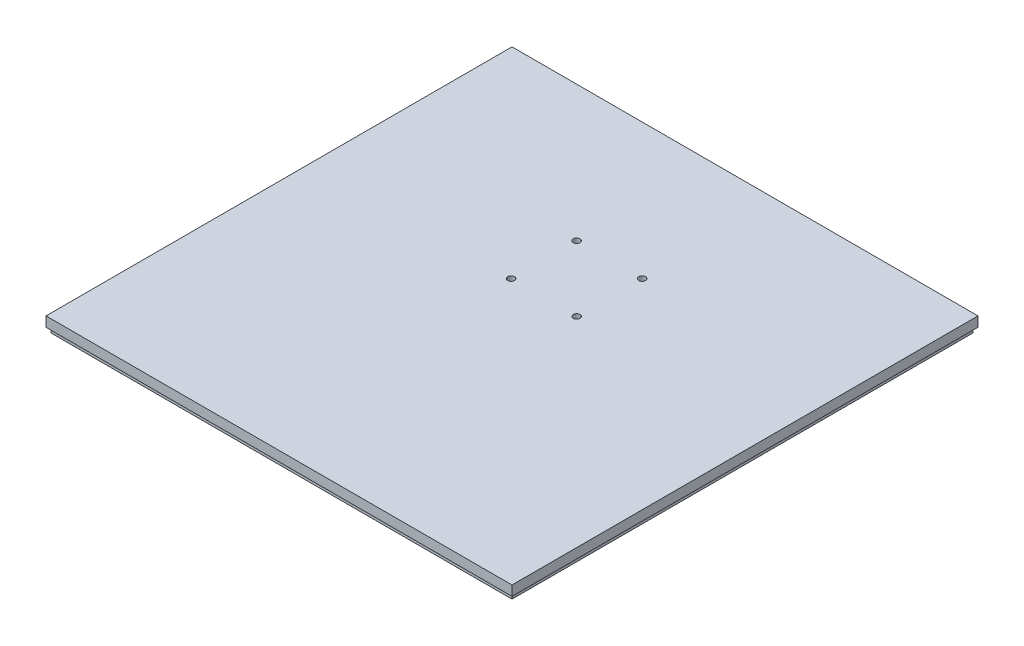
ISO-10303-21;
HEADER;
FILE_DESCRIPTION(('STEP AP214'),'2;1');
FILE_NAME('part.step','',(''),(''),'','','');
FILE_SCHEMA(('AUTOMOTIVE_DESIGN { 1 0 10303 214 1 1 1 1 }'));
ENDSEC;
DATA;
#1=APPLICATION_CONTEXT('core data for automotive mechanical design processes');
#2=APPLICATION_PROTOCOL_DEFINITION('international standard','automotive_design',2000,#1);
#3=PRODUCT_CONTEXT('',#1,'mechanical');
#4=PRODUCT('Part','Part','',(#3));
#5=PRODUCT_RELATED_PRODUCT_CATEGORY('part','',(#4));
#6=PRODUCT_DEFINITION_FORMATION('','',#4);
#7=PRODUCT_DEFINITION_CONTEXT('part definition',#1,'design');
#8=PRODUCT_DEFINITION('design','',#6,#7);
#9=PRODUCT_DEFINITION_SHAPE('','',#8);
#10=(LENGTH_UNIT() NAMED_UNIT(*) SI_UNIT(.MILLI.,.METRE.));
#11=(NAMED_UNIT(*) PLANE_ANGLE_UNIT() SI_UNIT($,.RADIAN.));
#12=(NAMED_UNIT(*) SI_UNIT($,.STERADIAN.) SOLID_ANGLE_UNIT());
#13=UNCERTAINTY_MEASURE_WITH_UNIT(LENGTH_MEASURE(1.E-05),#10,'distance_accuracy_value','');
#14=(GEOMETRIC_REPRESENTATION_CONTEXT(3) GLOBAL_UNCERTAINTY_ASSIGNED_CONTEXT((#13)) GLOBAL_UNIT_ASSIGNED_CONTEXT((#10,
#11,#12)) REPRESENTATION_CONTEXT('',''));
#15=CARTESIAN_POINT('',(0.,0.,0.));
#16=DIRECTION('',(0.,0.,1.));
#17=DIRECTION('',(1.,0.,0.));
#18=AXIS2_PLACEMENT_3D('',#15,#16,#17);
#19=CARTESIAN_POINT('',(296.8625,686.577127164248,296.8625));
#20=DIRECTION('',(-1.,0.,0.));
#21=DIRECTION('',(0.,0.,1.));
#22=AXIS2_PLACEMENT_3D('',#19,#20,#21);
#23=PLANE('',#22);
#24=DIRECTION('',(0.,0.,-1.));
#25=VECTOR('',#24,1.);
#26=CARTESIAN_POINT('',(296.8625,673.877127164248,296.8625));
#27=LINE('',#26,#25);
#28=CARTESIAN_POINT('',(296.8625,673.877127164248,296.8625));
#29=VERTEX_POINT('',#28);
#30=CARTESIAN_POINT('',(296.8625,673.877127164248,-296.8625));
#31=VERTEX_POINT('',#30);
#32=EDGE_CURVE('E174',#29,#31,#27,.T.);
#33=ORIENTED_EDGE('',*,*,#32,.F.);
#34=DIRECTION('',(0.,-1.,0.));
#35=VECTOR('',#34,1.);
#36=CARTESIAN_POINT('',(296.8625,686.577127164248,296.8625));
#37=LINE('',#36,#35);
#38=CARTESIAN_POINT('',(296.8625,667.527127164248,296.8625));
#39=VERTEX_POINT('',#38);
#40=EDGE_CURVE('E194',#29,#39,#37,.T.);
#41=ORIENTED_EDGE('',*,*,#40,.T.);
#42=DIRECTION('',(0.,0.,-1.));
#43=VECTOR('',#42,1.);
#44=CARTESIAN_POINT('',(296.8625,667.527127164248,296.8625));
#45=LINE('',#44,#43);
#46=CARTESIAN_POINT('',(296.8625,667.527127164248,-296.8625));
#47=VERTEX_POINT('',#46);
#48=EDGE_CURVE('E178',#39,#47,#45,.T.);
#49=ORIENTED_EDGE('',*,*,#48,.T.);
#50=DIRECTION('',(0.,-1.,0.));
#51=VECTOR('',#50,1.);
#52=CARTESIAN_POINT('',(296.8625,686.577127164248,-296.8625));
#53=LINE('',#52,#51);
#54=EDGE_CURVE('E52',#31,#47,#53,.T.);
#55=ORIENTED_EDGE('',*,*,#54,.F.);
#56=EDGE_LOOP('',(#33,#41,#49,#55));
#57=FACE_BOUND('',#56,.T.);
#58=ADVANCED_FACE('F44',(#57),#23,.F.);
#59=CARTESIAN_POINT('',(-296.8625,686.577127164248,-296.8625));
#60=DIRECTION('',(0.,0.,1.));
#61=DIRECTION('',(1.,0.,0.));
#62=AXIS2_PLACEMENT_3D('',#59,#60,#61);
#63=PLANE('',#62);
#64=DIRECTION('',(-1.,0.,0.));
#65=VECTOR('',#64,1.);
#66=CARTESIAN_POINT('',(-296.8625,673.877127164248,-296.8625));
#67=LINE('',#66,#65);
#68=CARTESIAN_POINT('',(-296.8625,673.877127164248,-296.8625));
#69=VERTEX_POINT('',#68);
#70=EDGE_CURVE('E59',#31,#69,#67,.T.);
#71=ORIENTED_EDGE('',*,*,#70,.F.);
#72=ORIENTED_EDGE('',*,*,#54,.T.);
#73=DIRECTION('',(-1.,0.,0.));
#74=VECTOR('',#73,1.);
#75=CARTESIAN_POINT('',(-296.8625,667.527127164248,-296.8625));
#76=LINE('',#75,#74);
#77=CARTESIAN_POINT('',(-296.8625,667.527127164248,-296.8625));
#78=VERTEX_POINT('',#77);
#79=EDGE_CURVE('E182',#47,#78,#76,.T.);
#80=ORIENTED_EDGE('',*,*,#79,.T.);
#81=DIRECTION('',(0.,-1.,0.));
#82=VECTOR('',#81,1.);
#83=CARTESIAN_POINT('',(-296.8625,686.577127164248,-296.8625));
#84=LINE('',#83,#82);
#85=EDGE_CURVE('E200',#69,#78,#84,.T.);
#86=ORIENTED_EDGE('',*,*,#85,.F.);
#87=EDGE_LOOP('',(#71,#72,#80,#86));
#88=FACE_BOUND('',#87,.T.);
#89=ADVANCED_FACE('F205',(#88),#63,.F.);
#90=CARTESIAN_POINT('',(-296.8625,686.577127164248,296.8625));
#91=DIRECTION('',(1.,0.,0.));
#92=DIRECTION('',(0.,0.,-1.));
#93=AXIS2_PLACEMENT_3D('',#90,#91,#92);
#94=PLANE('',#93);
#95=DIRECTION('',(0.,0.,1.));
#96=VECTOR('',#95,1.);
#97=CARTESIAN_POINT('',(-296.8625,673.877127164248,296.8625));
#98=LINE('',#97,#96);
#99=CARTESIAN_POINT('',(-296.8625,673.877127164248,296.8625));
#100=VERTEX_POINT('',#99);
#101=EDGE_CURVE('E67',#69,#100,#98,.T.);
#102=ORIENTED_EDGE('',*,*,#101,.F.);
#103=ORIENTED_EDGE('',*,*,#85,.T.);
#104=DIRECTION('',(0.,0.,1.));
#105=VECTOR('',#104,1.);
#106=CARTESIAN_POINT('',(-296.8625,667.527127164248,296.8625));
#107=LINE('',#106,#105);
#108=CARTESIAN_POINT('',(-296.8625,667.527127164248,296.8625));
#109=VERTEX_POINT('',#108);
#110=EDGE_CURVE('E186',#78,#109,#107,.T.);
#111=ORIENTED_EDGE('',*,*,#110,.T.);
#112=DIRECTION('',(0.,-1.,0.));
#113=VECTOR('',#112,1.);
#114=CARTESIAN_POINT('',(-296.8625,686.577127164248,296.8625));
#115=LINE('',#114,#113);
#116=EDGE_CURVE('E197',#100,#109,#115,.T.);
#117=ORIENTED_EDGE('',*,*,#116,.F.);
#118=EDGE_LOOP('',(#102,#103,#111,#117));
#119=FACE_BOUND('',#118,.T.);
#120=ADVANCED_FACE('F215',(#119),#94,.F.);
#121=CARTESIAN_POINT('',(-296.8625,686.577127164248,296.8625));
#122=DIRECTION('',(0.,0.,-1.));
#123=DIRECTION('',(-1.,0.,0.));
#124=AXIS2_PLACEMENT_3D('',#121,#122,#123);
#125=PLANE('',#124);
#126=DIRECTION('',(1.,0.,0.));
#127=VECTOR('',#126,1.);
#128=CARTESIAN_POINT('',(-296.8625,673.877127164248,296.8625));
#129=LINE('',#128,#127);
#130=EDGE_CURVE('E11',#100,#29,#129,.T.);
#131=ORIENTED_EDGE('',*,*,#130,.F.);
#132=ORIENTED_EDGE('',*,*,#116,.T.);
#133=DIRECTION('',(1.,0.,0.));
#134=VECTOR('',#133,1.);
#135=CARTESIAN_POINT('',(-296.8625,667.527127164248,296.8625));
#136=LINE('',#135,#134);
#137=EDGE_CURVE('E190',#109,#39,#136,.T.);
#138=ORIENTED_EDGE('',*,*,#137,.T.);
#139=ORIENTED_EDGE('',*,*,#40,.F.);
#140=EDGE_LOOP('',(#131,#132,#138,#139));
#141=FACE_BOUND('',#140,.T.);
#142=ADVANCED_FACE('F214',(#141),#125,.F.);
#143=CARTESIAN_POINT('',(0.,667.527127164248,0.));
#144=DIRECTION('',(0.,-1.,0.));
#145=DIRECTION('',(0.,0.,-1.));
#146=AXIS2_PLACEMENT_3D('',#143,#144,#145);
#147=PLANE('',#146);
#148=CARTESIAN_POINT('',(42.2072037690251,667.527127164248,-125.4125));
#149=DIRECTION('',(0.,-1.,0.));
#150=DIRECTION('',(0.,0.,-1.));
#151=AXIS2_PLACEMENT_3D('',#148,#149,#150);
#152=CIRCLE('',#151,4.365625);
#153=CARTESIAN_POINT('',(42.2072037690251,667.527127164248,-129.778125));
#154=VERTEX_POINT('',#153);
#155=EDGE_CURVE('E391',#154,#154,#152,.T.);
#156=ORIENTED_EDGE('',*,*,#155,.F.);
#157=EDGE_LOOP('',(#156));
#158=FACE_BOUND('',#157,.T.);
#159=CARTESIAN_POINT('',(-42.2072037690249,667.527127164248,-40.9980924619499));
#160=DIRECTION('',(0.,-1.,0.));
#161=DIRECTION('',(0.,0.,-1.));
#162=AXIS2_PLACEMENT_3D('',#159,#160,#161);
#163=CIRCLE('',#162,4.365625);
#164=CARTESIAN_POINT('',(-42.2072037690249,667.527127164248,-45.3637174619499));
#165=VERTEX_POINT('',#164);
#166=EDGE_CURVE('E400',#165,#165,#163,.T.);
#167=ORIENTED_EDGE('',*,*,#166,.F.);
#168=EDGE_LOOP('',(#167));
#169=FACE_BOUND('',#168,.T.);
#170=CARTESIAN_POINT('',(42.2072037690251,667.527127164248,-40.9980924619499));
#171=DIRECTION('',(0.,-1.,0.));
#172=DIRECTION('',(0.,0.,-1.));
#173=AXIS2_PLACEMENT_3D('',#170,#171,#172);
#174=CIRCLE('',#173,4.365625);
#175=CARTESIAN_POINT('',(42.2072037690251,667.527127164248,-45.3637174619499));
#176=VERTEX_POINT('',#175);
#177=EDGE_CURVE('E428',#176,#176,#174,.T.);
#178=ORIENTED_EDGE('',*,*,#177,.F.);
#179=EDGE_LOOP('',(#178));
#180=FACE_BOUND('',#179,.T.);
#181=CARTESIAN_POINT('',(-42.2072037690248,667.527127164248,-125.4125));
#182=DIRECTION('',(0.,-1.,0.));
#183=DIRECTION('',(0.,0.,-1.));
#184=AXIS2_PLACEMENT_3D('',#181,#182,#183);
#185=CIRCLE('',#184,4.365625);
#186=CARTESIAN_POINT('',(-42.2072037690248,667.527127164248,-129.778125));
#187=VERTEX_POINT('',#186);
#188=EDGE_CURVE('E147',#187,#187,#185,.T.);
#189=ORIENTED_EDGE('',*,*,#188,.F.);
#190=EDGE_LOOP('',(#189));
#191=FACE_BOUND('',#190,.T.);
#192=ORIENTED_EDGE('',*,*,#48,.F.);
#193=ORIENTED_EDGE('',*,*,#137,.F.);
#194=ORIENTED_EDGE('',*,*,#110,.F.);
#195=ORIENTED_EDGE('',*,*,#79,.F.);
#196=EDGE_LOOP('',(#192,#193,#194,#195));
#197=FACE_BOUND('',#196,.T.);
#198=ADVANCED_FACE('F211',(#158,#169,#180,#191,#197),#147,.T.);
#199=CARTESIAN_POINT('',(0.,673.877127164248,0.));
#200=DIRECTION('',(0.,1.,0.));
#201=DIRECTION('',(0.,0.,1.));
#202=AXIS2_PLACEMENT_3D('',#199,#200,#201);
#203=PLANE('',#202);
#204=DIRECTION('',(1.,0.,0.));
#205=VECTOR('',#204,1.);
#206=CARTESIAN_POINT('',(-300.0375,673.877127164248,300.0375));
#207=LINE('',#206,#205);
#208=CARTESIAN_POINT('',(-300.0375,673.877127164248,300.0375));
#209=VERTEX_POINT('',#208);
#210=CARTESIAN_POINT('',(300.0375,673.877127164248,300.0375));
#211=VERTEX_POINT('',#210);
#212=EDGE_CURVE('E130',#209,#211,#207,.T.);
#213=ORIENTED_EDGE('',*,*,#212,.F.);
#214=DIRECTION('',(0.,0.,1.));
#215=VECTOR('',#214,1.);
#216=CARTESIAN_POINT('',(-300.0375,673.877127164248,-300.0375));
#217=LINE('',#216,#215);
#218=CARTESIAN_POINT('',(-300.0375,673.877127164248,-300.0375));
#219=VERTEX_POINT('',#218);
#220=EDGE_CURVE('E122',#219,#209,#217,.T.);
#221=ORIENTED_EDGE('',*,*,#220,.F.);
#222=DIRECTION('',(-1.,0.,0.));
#223=VECTOR('',#222,1.);
#224=CARTESIAN_POINT('',(300.0375,673.877127164248,-300.0375));
#225=LINE('',#224,#223);
#226=CARTESIAN_POINT('',(300.0375,673.877127164248,-300.0375));
#227=VERTEX_POINT('',#226);
#228=EDGE_CURVE('E133',#227,#219,#225,.T.);
#229=ORIENTED_EDGE('',*,*,#228,.F.);
#230=DIRECTION('',(0.,0.,-1.));
#231=VECTOR('',#230,1.);
#232=CARTESIAN_POINT('',(300.0375,673.877127164248,300.0375));
#233=LINE('',#232,#231);
#234=EDGE_CURVE('E113',#211,#227,#233,.T.);
#235=ORIENTED_EDGE('',*,*,#234,.F.);
#236=EDGE_LOOP('',(#213,#221,#229,#235));
#237=FACE_BOUND('',#236,.T.);
#238=ORIENTED_EDGE('',*,*,#130,.T.);
#239=ORIENTED_EDGE('',*,*,#32,.T.);
#240=ORIENTED_EDGE('',*,*,#70,.T.);
#241=ORIENTED_EDGE('',*,*,#101,.T.);
#242=EDGE_LOOP('',(#238,#239,#240,#241));
#243=FACE_BOUND('',#242,.T.);
#244=ADVANCED_FACE('F127',(#237,#243),#203,.F.);
#245=CARTESIAN_POINT('',(-300.0375,673.877127164248,300.0375));
#246=DIRECTION('',(0.,0.,1.));
#247=DIRECTION('',(1.,0.,0.));
#248=AXIS2_PLACEMENT_3D('',#245,#246,#247);
#249=PLANE('',#248);
#250=DIRECTION('',(1.,0.,0.));
#251=VECTOR('',#250,1.);
#252=CARTESIAN_POINT('',(-300.0375,686.577127164248,300.0375));
#253=LINE('',#252,#251);
#254=CARTESIAN_POINT('',(-300.0375,686.577127164248,300.0375));
#255=VERTEX_POINT('',#254);
#256=CARTESIAN_POINT('',(300.0375,686.577127164248,300.0375));
#257=VERTEX_POINT('',#256);
#258=EDGE_CURVE('E154',#255,#257,#253,.T.);
#259=ORIENTED_EDGE('',*,*,#258,.F.);
#260=DIRECTION('',(0.,1.,0.));
#261=VECTOR('',#260,1.);
#262=CARTESIAN_POINT('',(-300.0375,673.877127164248,300.0375));
#263=LINE('',#262,#261);
#264=EDGE_CURVE('E137',#209,#255,#263,.T.);
#265=ORIENTED_EDGE('',*,*,#264,.F.);
#266=ORIENTED_EDGE('',*,*,#212,.T.);
#267=DIRECTION('',(0.,1.,0.));
#268=VECTOR('',#267,1.);
#269=CARTESIAN_POINT('',(300.0375,673.877127164248,300.0375));
#270=LINE('',#269,#268);
#271=EDGE_CURVE('E110',#211,#257,#270,.T.);
#272=ORIENTED_EDGE('',*,*,#271,.T.);
#273=EDGE_LOOP('',(#259,#265,#266,#272));
#274=FACE_BOUND('',#273,.T.);
#275=ADVANCED_FACE('F136',(#274),#249,.T.);
#276=CARTESIAN_POINT('',(-300.0375,673.877127164248,-300.0375));
#277=DIRECTION('',(-1.,0.,0.));
#278=DIRECTION('',(0.,0.,1.));
#279=AXIS2_PLACEMENT_3D('',#276,#277,#278);
#280=PLANE('',#279);
#281=DIRECTION('',(0.,0.,1.));
#282=VECTOR('',#281,1.);
#283=CARTESIAN_POINT('',(-300.0375,686.577127164248,-300.0375));
#284=LINE('',#283,#282);
#285=CARTESIAN_POINT('',(-300.0375,686.577127164248,-300.0375));
#286=VERTEX_POINT('',#285);
#287=EDGE_CURVE('E139',#286,#255,#284,.T.);
#288=ORIENTED_EDGE('',*,*,#287,.F.);
#289=DIRECTION('',(0.,1.,0.));
#290=VECTOR('',#289,1.);
#291=CARTESIAN_POINT('',(-300.0375,673.877127164248,-300.0375));
#292=LINE('',#291,#290);
#293=EDGE_CURVE('E165',#219,#286,#292,.T.);
#294=ORIENTED_EDGE('',*,*,#293,.F.);
#295=ORIENTED_EDGE('',*,*,#220,.T.);
#296=ORIENTED_EDGE('',*,*,#264,.T.);
#297=EDGE_LOOP('',(#288,#294,#295,#296));
#298=FACE_BOUND('',#297,.T.);
#299=ADVANCED_FACE('F222',(#298),#280,.T.);
#300=CARTESIAN_POINT('',(300.0375,673.877127164248,-300.0375));
#301=DIRECTION('',(0.,0.,-1.));
#302=DIRECTION('',(-1.,0.,0.));
#303=AXIS2_PLACEMENT_3D('',#300,#301,#302);
#304=PLANE('',#303);
#305=DIRECTION('',(-1.,0.,0.));
#306=VECTOR('',#305,1.);
#307=CARTESIAN_POINT('',(300.0375,686.577127164248,-300.0375));
#308=LINE('',#307,#306);
#309=CARTESIAN_POINT('',(300.0375,686.577127164248,-300.0375));
#310=VERTEX_POINT('',#309);
#311=EDGE_CURVE('E144',#310,#286,#308,.T.);
#312=ORIENTED_EDGE('',*,*,#311,.F.);
#313=DIRECTION('',(0.,1.,0.));
#314=VECTOR('',#313,1.);
#315=CARTESIAN_POINT('',(300.0375,673.877127164248,-300.0375));
#316=LINE('',#315,#314);
#317=EDGE_CURVE('E121',#227,#310,#316,.T.);
#318=ORIENTED_EDGE('',*,*,#317,.F.);
#319=ORIENTED_EDGE('',*,*,#228,.T.);
#320=ORIENTED_EDGE('',*,*,#293,.T.);
#321=EDGE_LOOP('',(#312,#318,#319,#320));
#322=FACE_BOUND('',#321,.T.);
#323=ADVANCED_FACE('F246',(#322),#304,.T.);
#324=CARTESIAN_POINT('',(300.0375,673.877127164248,300.0375));
#325=DIRECTION('',(1.,0.,0.));
#326=DIRECTION('',(0.,0.,-1.));
#327=AXIS2_PLACEMENT_3D('',#324,#325,#326);
#328=PLANE('',#327);
#329=DIRECTION('',(0.,0.,-1.));
#330=VECTOR('',#329,1.);
#331=CARTESIAN_POINT('',(300.0375,686.577127164248,300.0375));
#332=LINE('',#331,#330);
#333=EDGE_CURVE('E115',#257,#310,#332,.T.);
#334=ORIENTED_EDGE('',*,*,#333,.F.);
#335=ORIENTED_EDGE('',*,*,#271,.F.);
#336=ORIENTED_EDGE('',*,*,#234,.T.);
#337=ORIENTED_EDGE('',*,*,#317,.T.);
#338=EDGE_LOOP('',(#334,#335,#336,#337));
#339=FACE_BOUND('',#338,.T.);
#340=ADVANCED_FACE('F112',(#339),#328,.T.);
#341=CARTESIAN_POINT('',(0.,686.577127164248,0.));
#342=DIRECTION('',(0.,-1.,0.));
#343=DIRECTION('',(0.,0.,-1.));
#344=AXIS2_PLACEMENT_3D('',#341,#342,#343);
#345=PLANE('',#344);
#346=CARTESIAN_POINT('',(42.2072037690251,686.577127164248,-125.4125));
#347=DIRECTION('',(0.,-1.,0.));
#348=DIRECTION('',(0.,0.,-1.));
#349=AXIS2_PLACEMENT_3D('',#346,#347,#348);
#350=CIRCLE('',#349,4.365625);
#351=CARTESIAN_POINT('',(42.2072037690251,686.577127164248,-129.778125));
#352=VERTEX_POINT('',#351);
#353=EDGE_CURVE('E388',#352,#352,#350,.T.);
#354=ORIENTED_EDGE('',*,*,#353,.T.);
#355=EDGE_LOOP('',(#354));
#356=FACE_BOUND('',#355,.T.);
#357=CARTESIAN_POINT('',(-42.2072037690249,686.577127164248,-40.9980924619499));
#358=DIRECTION('',(0.,-1.,0.));
#359=DIRECTION('',(0.,0.,-1.));
#360=AXIS2_PLACEMENT_3D('',#357,#358,#359);
#361=CIRCLE('',#360,4.365625);
#362=CARTESIAN_POINT('',(-42.2072037690249,686.577127164248,-45.3637174619499));
#363=VERTEX_POINT('',#362);
#364=EDGE_CURVE('E393',#363,#363,#361,.T.);
#365=ORIENTED_EDGE('',*,*,#364,.T.);
#366=EDGE_LOOP('',(#365));
#367=FACE_BOUND('',#366,.T.);
#368=CARTESIAN_POINT('',(42.2072037690251,686.577127164248,-40.9980924619499));
#369=DIRECTION('',(0.,-1.,0.));
#370=DIRECTION('',(0.,0.,-1.));
#371=AXIS2_PLACEMENT_3D('',#368,#369,#370);
#372=CIRCLE('',#371,4.365625);
#373=CARTESIAN_POINT('',(42.2072037690251,686.577127164248,-45.3637174619499));
#374=VERTEX_POINT('',#373);
#375=EDGE_CURVE('E406',#374,#374,#372,.T.);
#376=ORIENTED_EDGE('',*,*,#375,.T.);
#377=EDGE_LOOP('',(#376));
#378=FACE_BOUND('',#377,.T.);
#379=CARTESIAN_POINT('',(-42.2072037690248,686.577127164248,-125.4125));
#380=DIRECTION('',(0.,-1.,0.));
#381=DIRECTION('',(0.,0.,-1.));
#382=AXIS2_PLACEMENT_3D('',#379,#380,#381);
#383=CIRCLE('',#382,4.365625);
#384=CARTESIAN_POINT('',(-42.2072037690248,686.577127164248,-129.778125));
#385=VERTEX_POINT('',#384);
#386=EDGE_CURVE('E157',#385,#385,#383,.T.);
#387=ORIENTED_EDGE('',*,*,#386,.T.);
#388=EDGE_LOOP('',(#387));
#389=FACE_BOUND('',#388,.T.);
#390=ORIENTED_EDGE('',*,*,#258,.T.);
#391=ORIENTED_EDGE('',*,*,#333,.T.);
#392=ORIENTED_EDGE('',*,*,#311,.T.);
#393=ORIENTED_EDGE('',*,*,#287,.T.);
#394=EDGE_LOOP('',(#390,#391,#392,#393));
#395=FACE_BOUND('',#394,.T.);
#396=ADVANCED_FACE('F239',(#356,#367,#378,#389,#395),#345,.F.);
#397=CARTESIAN_POINT('',(-42.2072037690248,686.577127164248,-125.4125));
#398=DIRECTION('',(0.,-1.,0.));
#399=DIRECTION('',(0.,0.,-1.));
#400=AXIS2_PLACEMENT_3D('',#397,#398,#399);
#401=CYLINDRICAL_SURFACE('',#400,4.365625);
#402=CARTESIAN_POINT('',(-42.2072037690248,686.577127164248,-129.778125));
#403=CARTESIAN_POINT('',(-42.2072037690248,686.378689664248,-129.778125));
#404=CARTESIAN_POINT('',(-42.2072037690248,686.180252164248,-129.778125));
#405=CARTESIAN_POINT('',(-42.2072037690248,685.783377164248,-129.778125));
#406=CARTESIAN_POINT('',(-42.2072037690248,685.584939664248,-129.778125));
#407=CARTESIAN_POINT('',(-42.2072037690248,685.188064664248,-129.778125));
#408=CARTESIAN_POINT('',(-42.2072037690248,684.989627164248,-129.778125));
#409=CARTESIAN_POINT('',(-42.2072037690248,684.592752164248,-129.778125));
#410=CARTESIAN_POINT('',(-42.2072037690248,684.394314664248,-129.778125));
#411=CARTESIAN_POINT('',(-42.2072037690248,683.997439664248,-129.778125));
#412=CARTESIAN_POINT('',(-42.2072037690248,683.799002164248,-129.778125));
#413=CARTESIAN_POINT('',(-42.2072037690248,683.402127164248,-129.778125));
#414=CARTESIAN_POINT('',(-42.2072037690248,683.203689664248,-129.778125));
#415=CARTESIAN_POINT('',(-42.2072037690248,682.806814664248,-129.778125));
#416=CARTESIAN_POINT('',(-42.2072037690248,682.608377164248,-129.778125));
#417=CARTESIAN_POINT('',(-42.2072037690248,682.211502164248,-129.778125));
#418=CARTESIAN_POINT('',(-42.2072037690248,682.013064664248,-129.778125));
#419=CARTESIAN_POINT('',(-42.2072037690248,681.616189664248,-129.778125));
#420=CARTESIAN_POINT('',(-42.2072037690248,681.417752164248,-129.778125));
#421=CARTESIAN_POINT('',(-42.2072037690248,681.020877164248,-129.778125));
#422=CARTESIAN_POINT('',(-42.2072037690248,680.822439664248,-129.778125));
#423=CARTESIAN_POINT('',(-42.2072037690248,680.425564664248,-129.778125));
#424=CARTESIAN_POINT('',(-42.2072037690248,680.227127164248,-129.778125));
#425=CARTESIAN_POINT('',(-42.2072037690248,679.830252164248,-129.778125));
#426=CARTESIAN_POINT('',(-42.2072037690248,679.631814664248,-129.778125));
#427=CARTESIAN_POINT('',(-42.2072037690248,679.234939664248,-129.778125));
#428=CARTESIAN_POINT('',(-42.2072037690248,679.036502164248,-129.778125));
#429=CARTESIAN_POINT('',(-42.2072037690248,678.639627164248,-129.778125));
#430=CARTESIAN_POINT('',(-42.2072037690248,678.441189664248,-129.778125));
#431=CARTESIAN_POINT('',(-42.2072037690248,678.044314664248,-129.778125));
#432=CARTESIAN_POINT('',(-42.2072037690248,677.845877164248,-129.778125));
#433=CARTESIAN_POINT('',(-42.2072037690248,677.449002164248,-129.778125));
#434=CARTESIAN_POINT('',(-42.2072037690248,677.250564664248,-129.778125));
#435=CARTESIAN_POINT('',(-42.2072037690248,676.853689664248,-129.778125));
#436=CARTESIAN_POINT('',(-42.2072037690248,676.655252164248,-129.778125));
#437=CARTESIAN_POINT('',(-42.2072037690248,676.258377164248,-129.778125));
#438=CARTESIAN_POINT('',(-42.2072037690248,676.059939664248,-129.778125));
#439=CARTESIAN_POINT('',(-42.2072037690248,675.663064664248,-129.778125));
#440=CARTESIAN_POINT('',(-42.2072037690248,675.464627164248,-129.778125));
#441=CARTESIAN_POINT('',(-42.2072037690248,675.067752164248,-129.778125));
#442=CARTESIAN_POINT('',(-42.2072037690248,674.869314664248,-129.778125));
#443=CARTESIAN_POINT('',(-42.2072037690248,674.472439664248,-129.778125));
#444=CARTESIAN_POINT('',(-42.2072037690248,674.274002164248,-129.778125));
#445=CARTESIAN_POINT('',(-42.2072037690248,673.877127164248,-129.778125));
#446=CARTESIAN_POINT('',(-42.2072037690248,673.678689664248,-129.778125));
#447=CARTESIAN_POINT('',(-42.2072037690248,673.281814664248,-129.778125));
#448=CARTESIAN_POINT('',(-42.2072037690248,673.083377164248,-129.778125));
#449=CARTESIAN_POINT('',(-42.2072037690248,672.686502164248,-129.778125));
#450=CARTESIAN_POINT('',(-42.2072037690248,672.488064664248,-129.778125));
#451=CARTESIAN_POINT('',(-42.2072037690248,672.091189664248,-129.778125));
#452=CARTESIAN_POINT('',(-42.2072037690248,671.892752164248,-129.778125));
#453=CARTESIAN_POINT('',(-42.2072037690248,671.495877164248,-129.778125));
#454=CARTESIAN_POINT('',(-42.2072037690248,671.297439664248,-129.778125));
#455=CARTESIAN_POINT('',(-42.2072037690248,670.900564664248,-129.778125));
#456=CARTESIAN_POINT('',(-42.2072037690248,670.702127164248,-129.778125));
#457=CARTESIAN_POINT('',(-42.2072037690248,670.305252164248,-129.778125));
#458=CARTESIAN_POINT('',(-42.2072037690248,670.106814664248,-129.778125));
#459=CARTESIAN_POINT('',(-42.2072037690248,669.709939664248,-129.778125));
#460=CARTESIAN_POINT('',(-42.2072037690248,669.511502164248,-129.778125));
#461=CARTESIAN_POINT('',(-42.2072037690248,669.114627164248,-129.778125));
#462=CARTESIAN_POINT('',(-42.2072037690248,668.916189664248,-129.778125));
#463=CARTESIAN_POINT('',(-42.2072037690248,668.519314664248,-129.778125));
#464=CARTESIAN_POINT('',(-42.2072037690248,668.320877164248,-129.778125));
#465=CARTESIAN_POINT('',(-42.2072037690248,667.924002164248,-129.778125));
#466=CARTESIAN_POINT('',(-42.2072037690248,667.725564664248,-129.778125));
#467=CARTESIAN_POINT('',(-42.2072037690248,667.527127164248,-129.778125));
#468=B_SPLINE_CURVE_WITH_KNOTS('',3,(#402,#403,#404,#405,#406,#407,#408,#409,#410,#411,#412,
#413,#414,#415,#416,#417,#418,#419,#420,#421,#422,#423,#424,#425,#426,#427,#428,#429,#430,#431,
#432,#433,#434,#435,#436,#437,#438,#439,#440,#441,#442,#443,#444,#445,#446,#447,#448,#449,#450,
#451,#452,#453,#454,#455,#456,#457,#458,#459,#460,#461,#462,#463,#464,#465,#466,#467),
.UNSPECIFIED.,.F.,.F.,(4,2,2,2,2,2,2,2,2,2,2,2,2,2,2,2,2,2,2,2,2,2,2,2,2,2,2,2,2,2,2,2,4),(0.,
0.5953125,1.190625,1.7859375,2.38125,2.9765625,3.571875,4.1671875,4.7625,5.3578125,5.953125,
6.5484375,7.14375,7.7390625,8.334375,8.92968750000001,9.52500000000001,10.1203125,10.715625,
11.3109375,11.90625,12.5015625,13.096875,13.6921875,14.2875,14.8828125,15.478125,16.0734375,
16.66875,17.2640625,17.859375,18.4546875,19.05),.UNSPECIFIED.);
#469=EDGE_CURVE('BSEAM241',#385,#187,#468,.T.);
#470=ORIENTED_EDGE('',*,*,#386,.F.);
#471=ORIENTED_EDGE('',*,*,#188,.T.);
#472=ORIENTED_EDGE('',*,*,#469,.T.);
#473=ORIENTED_EDGE('',*,*,#469,.F.);
#474=EDGE_LOOP('',(#470,#472,#471,#473));
#475=FACE_BOUND('',#474,.T.);
#476=ADVANCED_FACE('F241',(#475),#401,.F.);
#477=CARTESIAN_POINT('',(42.2072037690251,686.577127164248,-40.9980924619499));
#478=DIRECTION('',(0.,-1.,0.));
#479=DIRECTION('',(0.,0.,-1.));
#480=AXIS2_PLACEMENT_3D('',#477,#478,#479);
#481=CYLINDRICAL_SURFACE('',#480,4.365625);
#482=CARTESIAN_POINT('',(42.2072037690251,686.577127164248,-45.3637174619499));
#483=CARTESIAN_POINT('',(42.2072037690251,686.378689664248,-45.3637174619499));
#484=CARTESIAN_POINT('',(42.2072037690251,686.180252164248,-45.3637174619499));
#485=CARTESIAN_POINT('',(42.2072037690251,685.783377164248,-45.3637174619499));
#486=CARTESIAN_POINT('',(42.2072037690251,685.584939664248,-45.3637174619499));
#487=CARTESIAN_POINT('',(42.2072037690251,685.188064664248,-45.3637174619499));
#488=CARTESIAN_POINT('',(42.2072037690251,684.989627164248,-45.3637174619499));
#489=CARTESIAN_POINT('',(42.2072037690251,684.592752164248,-45.3637174619499));
#490=CARTESIAN_POINT('',(42.2072037690251,684.394314664248,-45.3637174619499));
#491=CARTESIAN_POINT('',(42.2072037690251,683.997439664248,-45.3637174619499));
#492=CARTESIAN_POINT('',(42.2072037690251,683.799002164248,-45.3637174619499));
#493=CARTESIAN_POINT('',(42.2072037690251,683.402127164248,-45.3637174619499));
#494=CARTESIAN_POINT('',(42.2072037690251,683.203689664248,-45.3637174619499));
#495=CARTESIAN_POINT('',(42.2072037690251,682.806814664248,-45.3637174619499));
#496=CARTESIAN_POINT('',(42.2072037690251,682.608377164248,-45.3637174619499));
#497=CARTESIAN_POINT('',(42.2072037690251,682.211502164248,-45.3637174619499));
#498=CARTESIAN_POINT('',(42.2072037690251,682.013064664248,-45.3637174619499));
#499=CARTESIAN_POINT('',(42.2072037690251,681.616189664248,-45.3637174619499));
#500=CARTESIAN_POINT('',(42.2072037690251,681.417752164248,-45.3637174619499));
#501=CARTESIAN_POINT('',(42.2072037690251,681.020877164248,-45.3637174619499));
#502=CARTESIAN_POINT('',(42.2072037690251,680.822439664248,-45.3637174619499));
#503=CARTESIAN_POINT('',(42.2072037690251,680.425564664248,-45.3637174619499));
#504=CARTESIAN_POINT('',(42.2072037690251,680.227127164248,-45.3637174619499));
#505=CARTESIAN_POINT('',(42.2072037690251,679.830252164248,-45.3637174619499));
#506=CARTESIAN_POINT('',(42.2072037690251,679.631814664248,-45.3637174619499));
#507=CARTESIAN_POINT('',(42.2072037690251,679.234939664248,-45.3637174619499));
#508=CARTESIAN_POINT('',(42.2072037690251,679.036502164248,-45.3637174619499));
#509=CARTESIAN_POINT('',(42.2072037690251,678.639627164248,-45.3637174619499));
#510=CARTESIAN_POINT('',(42.2072037690251,678.441189664248,-45.3637174619499));
#511=CARTESIAN_POINT('',(42.2072037690251,678.044314664248,-45.3637174619499));
#512=CARTESIAN_POINT('',(42.2072037690251,677.845877164248,-45.3637174619499));
#513=CARTESIAN_POINT('',(42.2072037690251,677.449002164248,-45.3637174619499));
#514=CARTESIAN_POINT('',(42.2072037690251,677.250564664248,-45.3637174619499));
#515=CARTESIAN_POINT('',(42.2072037690251,676.853689664248,-45.3637174619499));
#516=CARTESIAN_POINT('',(42.2072037690251,676.655252164248,-45.3637174619499));
#517=CARTESIAN_POINT('',(42.2072037690251,676.258377164248,-45.3637174619499));
#518=CARTESIAN_POINT('',(42.2072037690251,676.059939664248,-45.3637174619499));
#519=CARTESIAN_POINT('',(42.2072037690251,675.663064664248,-45.3637174619499));
#520=CARTESIAN_POINT('',(42.2072037690251,675.464627164248,-45.3637174619499));
#521=CARTESIAN_POINT('',(42.2072037690251,675.067752164248,-45.3637174619499));
#522=CARTESIAN_POINT('',(42.2072037690251,674.869314664248,-45.3637174619499));
#523=CARTESIAN_POINT('',(42.2072037690251,674.472439664248,-45.3637174619499));
#524=CARTESIAN_POINT('',(42.2072037690251,674.274002164248,-45.3637174619499));
#525=CARTESIAN_POINT('',(42.2072037690251,673.877127164248,-45.3637174619499));
#526=CARTESIAN_POINT('',(42.2072037690251,673.678689664248,-45.3637174619499));
#527=CARTESIAN_POINT('',(42.2072037690251,673.281814664248,-45.3637174619499));
#528=CARTESIAN_POINT('',(42.2072037690251,673.083377164248,-45.3637174619499));
#529=CARTESIAN_POINT('',(42.2072037690251,672.686502164248,-45.3637174619499));
#530=CARTESIAN_POINT('',(42.2072037690251,672.488064664248,-45.3637174619499));
#531=CARTESIAN_POINT('',(42.2072037690251,672.091189664248,-45.3637174619499));
#532=CARTESIAN_POINT('',(42.2072037690251,671.892752164248,-45.3637174619499));
#533=CARTESIAN_POINT('',(42.2072037690251,671.495877164248,-45.3637174619499));
#534=CARTESIAN_POINT('',(42.2072037690251,671.297439664248,-45.3637174619499));
#535=CARTESIAN_POINT('',(42.2072037690251,670.900564664248,-45.3637174619499));
#536=CARTESIAN_POINT('',(42.2072037690251,670.702127164248,-45.3637174619499));
#537=CARTESIAN_POINT('',(42.2072037690251,670.305252164248,-45.3637174619499));
#538=CARTESIAN_POINT('',(42.2072037690251,670.106814664248,-45.3637174619499));
#539=CARTESIAN_POINT('',(42.2072037690251,669.709939664248,-45.3637174619499));
#540=CARTESIAN_POINT('',(42.2072037690251,669.511502164248,-45.3637174619499));
#541=CARTESIAN_POINT('',(42.2072037690251,669.114627164248,-45.3637174619499));
#542=CARTESIAN_POINT('',(42.2072037690251,668.916189664248,-45.3637174619499));
#543=CARTESIAN_POINT('',(42.2072037690251,668.519314664248,-45.3637174619499));
#544=CARTESIAN_POINT('',(42.2072037690251,668.320877164248,-45.3637174619499));
#545=CARTESIAN_POINT('',(42.2072037690251,667.924002164248,-45.3637174619499));
#546=CARTESIAN_POINT('',(42.2072037690251,667.725564664248,-45.3637174619499));
#547=CARTESIAN_POINT('',(42.2072037690251,667.527127164248,-45.3637174619499));
#548=B_SPLINE_CURVE_WITH_KNOTS('',3,(#482,#483,#484,#485,#486,#487,#488,#489,#490,#491,#492,
#493,#494,#495,#496,#497,#498,#499,#500,#501,#502,#503,#504,#505,#506,#507,#508,#509,#510,#511,
#512,#513,#514,#515,#516,#517,#518,#519,#520,#521,#522,#523,#524,#525,#526,#527,#528,#529,#530,
#531,#532,#533,#534,#535,#536,#537,#538,#539,#540,#541,#542,#543,#544,#545,#546,#547),
.UNSPECIFIED.,.F.,.F.,(4,2,2,2,2,2,2,2,2,2,2,2,2,2,2,2,2,2,2,2,2,2,2,2,2,2,2,2,2,2,2,2,4),(0.,
0.5953125,1.190625,1.7859375,2.38125,2.9765625,3.571875,4.1671875,4.7625,5.3578125,5.953125,
6.5484375,7.14375,7.7390625,8.334375,8.92968750000001,9.52500000000001,10.1203125,10.715625,
11.3109375,11.90625,12.5015625,13.096875,13.6921875,14.2875,14.8828125,15.478125,16.0734375,
16.66875,17.2640625,17.859375,18.4546875,19.05),.UNSPECIFIED.);
#549=EDGE_CURVE('BSEAM276',#374,#176,#548,.T.);
#550=ORIENTED_EDGE('',*,*,#375,.F.);
#551=ORIENTED_EDGE('',*,*,#177,.T.);
#552=ORIENTED_EDGE('',*,*,#549,.T.);
#553=ORIENTED_EDGE('',*,*,#549,.F.);
#554=EDGE_LOOP('',(#550,#552,#551,#553));
#555=FACE_BOUND('',#554,.T.);
#556=ADVANCED_FACE('F276',(#555),#481,.F.);
#557=CARTESIAN_POINT('',(-42.2072037690249,686.577127164248,-40.9980924619499));
#558=DIRECTION('',(0.,-1.,0.));
#559=DIRECTION('',(0.,0.,-1.));
#560=AXIS2_PLACEMENT_3D('',#557,#558,#559);
#561=CYLINDRICAL_SURFACE('',#560,4.365625);
#562=CARTESIAN_POINT('',(-42.2072037690249,686.577127164248,-45.3637174619499));
#563=CARTESIAN_POINT('',(-42.2072037690249,686.378689664248,-45.3637174619499));
#564=CARTESIAN_POINT('',(-42.2072037690249,686.180252164248,-45.3637174619499));
#565=CARTESIAN_POINT('',(-42.2072037690249,685.783377164248,-45.3637174619499));
#566=CARTESIAN_POINT('',(-42.2072037690249,685.584939664248,-45.3637174619499));
#567=CARTESIAN_POINT('',(-42.2072037690249,685.188064664248,-45.3637174619499));
#568=CARTESIAN_POINT('',(-42.2072037690249,684.989627164248,-45.3637174619499));
#569=CARTESIAN_POINT('',(-42.2072037690249,684.592752164248,-45.3637174619499));
#570=CARTESIAN_POINT('',(-42.2072037690249,684.394314664248,-45.3637174619499));
#571=CARTESIAN_POINT('',(-42.2072037690249,683.997439664248,-45.3637174619499));
#572=CARTESIAN_POINT('',(-42.2072037690249,683.799002164248,-45.3637174619499));
#573=CARTESIAN_POINT('',(-42.2072037690249,683.402127164248,-45.3637174619499));
#574=CARTESIAN_POINT('',(-42.2072037690249,683.203689664248,-45.3637174619499));
#575=CARTESIAN_POINT('',(-42.2072037690249,682.806814664248,-45.3637174619499));
#576=CARTESIAN_POINT('',(-42.2072037690249,682.608377164248,-45.3637174619499));
#577=CARTESIAN_POINT('',(-42.2072037690249,682.211502164248,-45.3637174619499));
#578=CARTESIAN_POINT('',(-42.2072037690249,682.013064664248,-45.3637174619499));
#579=CARTESIAN_POINT('',(-42.2072037690249,681.616189664248,-45.3637174619499));
#580=CARTESIAN_POINT('',(-42.2072037690249,681.417752164248,-45.3637174619499));
#581=CARTESIAN_POINT('',(-42.2072037690249,681.020877164248,-45.3637174619499));
#582=CARTESIAN_POINT('',(-42.2072037690249,680.822439664248,-45.3637174619499));
#583=CARTESIAN_POINT('',(-42.2072037690249,680.425564664248,-45.3637174619499));
#584=CARTESIAN_POINT('',(-42.2072037690249,680.227127164248,-45.3637174619499));
#585=CARTESIAN_POINT('',(-42.2072037690249,679.830252164248,-45.3637174619499));
#586=CARTESIAN_POINT('',(-42.2072037690249,679.631814664248,-45.3637174619499));
#587=CARTESIAN_POINT('',(-42.2072037690249,679.234939664248,-45.3637174619499));
#588=CARTESIAN_POINT('',(-42.2072037690249,679.036502164248,-45.3637174619499));
#589=CARTESIAN_POINT('',(-42.2072037690249,678.639627164248,-45.3637174619499));
#590=CARTESIAN_POINT('',(-42.2072037690249,678.441189664248,-45.3637174619499));
#591=CARTESIAN_POINT('',(-42.2072037690249,678.044314664248,-45.3637174619499));
#592=CARTESIAN_POINT('',(-42.2072037690249,677.845877164248,-45.3637174619499));
#593=CARTESIAN_POINT('',(-42.2072037690249,677.449002164248,-45.3637174619499));
#594=CARTESIAN_POINT('',(-42.2072037690249,677.250564664248,-45.3637174619499));
#595=CARTESIAN_POINT('',(-42.2072037690249,676.853689664248,-45.3637174619499));
#596=CARTESIAN_POINT('',(-42.2072037690249,676.655252164248,-45.3637174619499));
#597=CARTESIAN_POINT('',(-42.2072037690249,676.258377164248,-45.3637174619499));
#598=CARTESIAN_POINT('',(-42.2072037690249,676.059939664248,-45.3637174619499));
#599=CARTESIAN_POINT('',(-42.2072037690249,675.663064664248,-45.3637174619499));
#600=CARTESIAN_POINT('',(-42.2072037690249,675.464627164248,-45.3637174619499));
#601=CARTESIAN_POINT('',(-42.2072037690249,675.067752164248,-45.3637174619499));
#602=CARTESIAN_POINT('',(-42.2072037690249,674.869314664248,-45.3637174619499));
#603=CARTESIAN_POINT('',(-42.2072037690249,674.472439664248,-45.3637174619499));
#604=CARTESIAN_POINT('',(-42.2072037690249,674.274002164248,-45.3637174619499));
#605=CARTESIAN_POINT('',(-42.2072037690249,673.877127164248,-45.3637174619499));
#606=CARTESIAN_POINT('',(-42.2072037690249,673.678689664248,-45.3637174619499));
#607=CARTESIAN_POINT('',(-42.2072037690249,673.281814664248,-45.3637174619499));
#608=CARTESIAN_POINT('',(-42.2072037690249,673.083377164248,-45.3637174619499));
#609=CARTESIAN_POINT('',(-42.2072037690249,672.686502164248,-45.3637174619499));
#610=CARTESIAN_POINT('',(-42.2072037690249,672.488064664248,-45.3637174619499));
#611=CARTESIAN_POINT('',(-42.2072037690249,672.091189664248,-45.3637174619499));
#612=CARTESIAN_POINT('',(-42.2072037690249,671.892752164248,-45.3637174619499));
#613=CARTESIAN_POINT('',(-42.2072037690249,671.495877164248,-45.3637174619499));
#614=CARTESIAN_POINT('',(-42.2072037690249,671.297439664248,-45.3637174619499));
#615=CARTESIAN_POINT('',(-42.2072037690249,670.900564664248,-45.3637174619499));
#616=CARTESIAN_POINT('',(-42.2072037690249,670.702127164248,-45.3637174619499));
#617=CARTESIAN_POINT('',(-42.2072037690249,670.305252164248,-45.3637174619499));
#618=CARTESIAN_POINT('',(-42.2072037690249,670.106814664248,-45.3637174619499));
#619=CARTESIAN_POINT('',(-42.2072037690249,669.709939664248,-45.3637174619499));
#620=CARTESIAN_POINT('',(-42.2072037690249,669.511502164248,-45.3637174619499));
#621=CARTESIAN_POINT('',(-42.2072037690249,669.114627164248,-45.3637174619499));
#622=CARTESIAN_POINT('',(-42.2072037690249,668.916189664248,-45.3637174619499));
#623=CARTESIAN_POINT('',(-42.2072037690249,668.519314664248,-45.3637174619499));
#624=CARTESIAN_POINT('',(-42.2072037690249,668.320877164248,-45.3637174619499));
#625=CARTESIAN_POINT('',(-42.2072037690249,667.924002164248,-45.3637174619499));
#626=CARTESIAN_POINT('',(-42.2072037690249,667.725564664248,-45.3637174619499));
#627=CARTESIAN_POINT('',(-42.2072037690249,667.527127164248,-45.3637174619499));
#628=B_SPLINE_CURVE_WITH_KNOTS('',3,(#562,#563,#564,#565,#566,#567,#568,#569,#570,#571,#572,
#573,#574,#575,#576,#577,#578,#579,#580,#581,#582,#583,#584,#585,#586,#587,#588,#589,#590,#591,
#592,#593,#594,#595,#596,#597,#598,#599,#600,#601,#602,#603,#604,#605,#606,#607,#608,#609,#610,
#611,#612,#613,#614,#615,#616,#617,#618,#619,#620,#621,#622,#623,#624,#625,#626,#627),
.UNSPECIFIED.,.F.,.F.,(4,2,2,2,2,2,2,2,2,2,2,2,2,2,2,2,2,2,2,2,2,2,2,2,2,2,2,2,2,2,2,2,4),(0.,
0.5953125,1.190625,1.7859375,2.38125,2.9765625,3.571875,4.1671875,4.7625,5.3578125,5.953125,
6.5484375,7.14375,7.7390625,8.334375,8.92968750000001,9.52500000000001,10.1203125,10.715625,
11.3109375,11.90625,12.5015625,13.096875,13.6921875,14.2875,14.8828125,15.478125,16.0734375,
16.66875,17.2640625,17.859375,18.4546875,19.05),.UNSPECIFIED.);
#629=EDGE_CURVE('BSEAM283',#363,#165,#628,.T.);
#630=ORIENTED_EDGE('',*,*,#364,.F.);
#631=ORIENTED_EDGE('',*,*,#166,.T.);
#632=ORIENTED_EDGE('',*,*,#629,.T.);
#633=ORIENTED_EDGE('',*,*,#629,.F.);
#634=EDGE_LOOP('',(#630,#632,#631,#633));
#635=FACE_BOUND('',#634,.T.);
#636=ADVANCED_FACE('F283',(#635),#561,.F.);
#637=CARTESIAN_POINT('',(42.2072037690251,686.577127164248,-125.4125));
#638=DIRECTION('',(0.,-1.,0.));
#639=DIRECTION('',(0.,0.,-1.));
#640=AXIS2_PLACEMENT_3D('',#637,#638,#639);
#641=CYLINDRICAL_SURFACE('',#640,4.365625);
#642=CARTESIAN_POINT('',(42.2072037690251,686.577127164248,-129.778125));
#643=CARTESIAN_POINT('',(42.2072037690251,686.378689664248,-129.778125));
#644=CARTESIAN_POINT('',(42.2072037690251,686.180252164248,-129.778125));
#645=CARTESIAN_POINT('',(42.2072037690251,685.783377164248,-129.778125));
#646=CARTESIAN_POINT('',(42.2072037690251,685.584939664248,-129.778125));
#647=CARTESIAN_POINT('',(42.2072037690251,685.188064664248,-129.778125));
#648=CARTESIAN_POINT('',(42.2072037690251,684.989627164248,-129.778125));
#649=CARTESIAN_POINT('',(42.2072037690251,684.592752164248,-129.778125));
#650=CARTESIAN_POINT('',(42.2072037690251,684.394314664248,-129.778125));
#651=CARTESIAN_POINT('',(42.2072037690251,683.997439664248,-129.778125));
#652=CARTESIAN_POINT('',(42.2072037690251,683.799002164248,-129.778125));
#653=CARTESIAN_POINT('',(42.2072037690251,683.402127164248,-129.778125));
#654=CARTESIAN_POINT('',(42.2072037690251,683.203689664248,-129.778125));
#655=CARTESIAN_POINT('',(42.2072037690251,682.806814664248,-129.778125));
#656=CARTESIAN_POINT('',(42.2072037690251,682.608377164248,-129.778125));
#657=CARTESIAN_POINT('',(42.2072037690251,682.211502164248,-129.778125));
#658=CARTESIAN_POINT('',(42.2072037690251,682.013064664248,-129.778125));
#659=CARTESIAN_POINT('',(42.2072037690251,681.616189664248,-129.778125));
#660=CARTESIAN_POINT('',(42.2072037690251,681.417752164248,-129.778125));
#661=CARTESIAN_POINT('',(42.2072037690251,681.020877164248,-129.778125));
#662=CARTESIAN_POINT('',(42.2072037690251,680.822439664248,-129.778125));
#663=CARTESIAN_POINT('',(42.2072037690251,680.425564664248,-129.778125));
#664=CARTESIAN_POINT('',(42.2072037690251,680.227127164248,-129.778125));
#665=CARTESIAN_POINT('',(42.2072037690251,679.830252164248,-129.778125));
#666=CARTESIAN_POINT('',(42.2072037690251,679.631814664248,-129.778125));
#667=CARTESIAN_POINT('',(42.2072037690251,679.234939664248,-129.778125));
#668=CARTESIAN_POINT('',(42.2072037690251,679.036502164248,-129.778125));
#669=CARTESIAN_POINT('',(42.2072037690251,678.639627164248,-129.778125));
#670=CARTESIAN_POINT('',(42.2072037690251,678.441189664248,-129.778125));
#671=CARTESIAN_POINT('',(42.2072037690251,678.044314664248,-129.778125));
#672=CARTESIAN_POINT('',(42.2072037690251,677.845877164248,-129.778125));
#673=CARTESIAN_POINT('',(42.2072037690251,677.449002164248,-129.778125));
#674=CARTESIAN_POINT('',(42.2072037690251,677.250564664248,-129.778125));
#675=CARTESIAN_POINT('',(42.2072037690251,676.853689664248,-129.778125));
#676=CARTESIAN_POINT('',(42.2072037690251,676.655252164248,-129.778125));
#677=CARTESIAN_POINT('',(42.2072037690251,676.258377164248,-129.778125));
#678=CARTESIAN_POINT('',(42.2072037690251,676.059939664248,-129.778125));
#679=CARTESIAN_POINT('',(42.2072037690251,675.663064664248,-129.778125));
#680=CARTESIAN_POINT('',(42.2072037690251,675.464627164248,-129.778125));
#681=CARTESIAN_POINT('',(42.2072037690251,675.067752164248,-129.778125));
#682=CARTESIAN_POINT('',(42.2072037690251,674.869314664248,-129.778125));
#683=CARTESIAN_POINT('',(42.2072037690251,674.472439664248,-129.778125));
#684=CARTESIAN_POINT('',(42.2072037690251,674.274002164248,-129.778125));
#685=CARTESIAN_POINT('',(42.2072037690251,673.877127164248,-129.778125));
#686=CARTESIAN_POINT('',(42.2072037690251,673.678689664248,-129.778125));
#687=CARTESIAN_POINT('',(42.2072037690251,673.281814664248,-129.778125));
#688=CARTESIAN_POINT('',(42.2072037690251,673.083377164248,-129.778125));
#689=CARTESIAN_POINT('',(42.2072037690251,672.686502164248,-129.778125));
#690=CARTESIAN_POINT('',(42.2072037690251,672.488064664248,-129.778125));
#691=CARTESIAN_POINT('',(42.2072037690251,672.091189664248,-129.778125));
#692=CARTESIAN_POINT('',(42.2072037690251,671.892752164248,-129.778125));
#693=CARTESIAN_POINT('',(42.2072037690251,671.495877164248,-129.778125));
#694=CARTESIAN_POINT('',(42.2072037690251,671.297439664248,-129.778125));
#695=CARTESIAN_POINT('',(42.2072037690251,670.900564664248,-129.778125));
#696=CARTESIAN_POINT('',(42.2072037690251,670.702127164248,-129.778125));
#697=CARTESIAN_POINT('',(42.2072037690251,670.305252164248,-129.778125));
#698=CARTESIAN_POINT('',(42.2072037690251,670.106814664248,-129.778125));
#699=CARTESIAN_POINT('',(42.2072037690251,669.709939664248,-129.778125));
#700=CARTESIAN_POINT('',(42.2072037690251,669.511502164248,-129.778125));
#701=CARTESIAN_POINT('',(42.2072037690251,669.114627164248,-129.778125));
#702=CARTESIAN_POINT('',(42.2072037690251,668.916189664248,-129.778125));
#703=CARTESIAN_POINT('',(42.2072037690251,668.519314664248,-129.778125));
#704=CARTESIAN_POINT('',(42.2072037690251,668.320877164248,-129.778125));
#705=CARTESIAN_POINT('',(42.2072037690251,667.924002164248,-129.778125));
#706=CARTESIAN_POINT('',(42.2072037690251,667.725564664248,-129.778125));
#707=CARTESIAN_POINT('',(42.2072037690251,667.527127164248,-129.778125));
#708=B_SPLINE_CURVE_WITH_KNOTS('',3,(#642,#643,#644,#645,#646,#647,#648,#649,#650,#651,#652,
#653,#654,#655,#656,#657,#658,#659,#660,#661,#662,#663,#664,#665,#666,#667,#668,#669,#670,#671,
#672,#673,#674,#675,#676,#677,#678,#679,#680,#681,#682,#683,#684,#685,#686,#687,#688,#689,#690,
#691,#692,#693,#694,#695,#696,#697,#698,#699,#700,#701,#702,#703,#704,#705,#706,#707),
.UNSPECIFIED.,.F.,.F.,(4,2,2,2,2,2,2,2,2,2,2,2,2,2,2,2,2,2,2,2,2,2,2,2,2,2,2,2,2,2,2,2,4),(0.,
0.5953125,1.190625,1.7859375,2.38125,2.9765625,3.571875,4.1671875,4.7625,5.3578125,5.953125,
6.5484375,7.14375,7.7390625,8.334375,8.92968750000001,9.52500000000001,10.1203125,10.715625,
11.3109375,11.90625,12.5015625,13.096875,13.6921875,14.2875,14.8828125,15.478125,16.0734375,
16.66875,17.2640625,17.859375,18.4546875,19.05),.UNSPECIFIED.);
#709=EDGE_CURVE('BSEAM291',#352,#154,#708,.T.);
#710=ORIENTED_EDGE('',*,*,#353,.F.);
#711=ORIENTED_EDGE('',*,*,#155,.T.);
#712=ORIENTED_EDGE('',*,*,#709,.T.);
#713=ORIENTED_EDGE('',*,*,#709,.F.);
#714=EDGE_LOOP('',(#710,#712,#711,#713));
#715=FACE_BOUND('',#714,.T.);
#716=ADVANCED_FACE('F291',(#715),#641,.F.);
#717=CLOSED_SHELL('',(#58,#89,#120,#142,#198,#244,#275,#299,#323,#340,#396,#476,#556,#636,#716));
#718=MANIFOLD_SOLID_BREP('B2',#717);
#719=ADVANCED_BREP_SHAPE_REPRESENTATION('',(#18,#718),#14);
#720=SHAPE_DEFINITION_REPRESENTATION(#9,#719);
ENDSEC;
END-ISO-10303-21;
